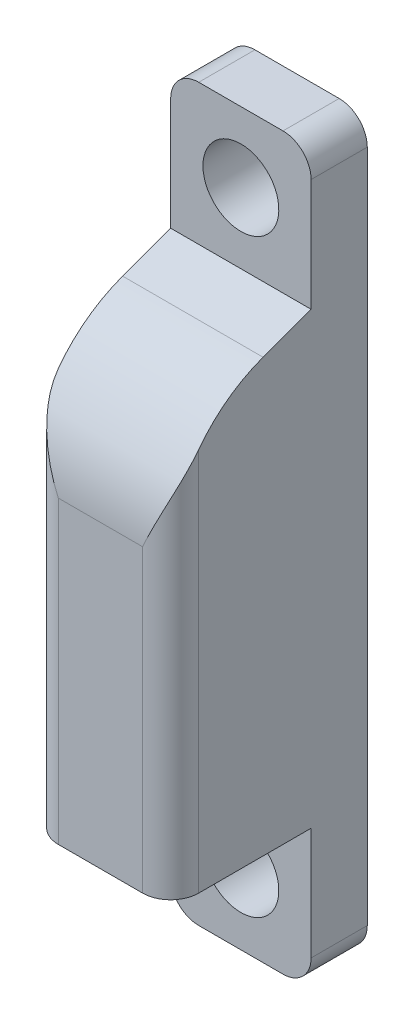
ISO-10303-21;
HEADER;
FILE_DESCRIPTION(('STEP AP214'),'2;1');
FILE_NAME('part.step','',(''),(''),'','','');
FILE_SCHEMA(('AUTOMOTIVE_DESIGN { 1 0 10303 214 1 1 1 1 }'));
ENDSEC;
DATA;
#1=APPLICATION_CONTEXT('core data for automotive mechanical design processes');
#2=APPLICATION_PROTOCOL_DEFINITION('international standard','automotive_design',2000,#1);
#3=PRODUCT_CONTEXT('',#1,'mechanical');
#4=PRODUCT('Part','Part','',(#3));
#5=PRODUCT_RELATED_PRODUCT_CATEGORY('part','',(#4));
#6=PRODUCT_DEFINITION_FORMATION('','',#4);
#7=PRODUCT_DEFINITION_CONTEXT('part definition',#1,'design');
#8=PRODUCT_DEFINITION('design','',#6,#7);
#9=PRODUCT_DEFINITION_SHAPE('','',#8);
#10=(LENGTH_UNIT() NAMED_UNIT(*) SI_UNIT(.MILLI.,.METRE.));
#11=(NAMED_UNIT(*) PLANE_ANGLE_UNIT() SI_UNIT($,.RADIAN.));
#12=(NAMED_UNIT(*) SI_UNIT($,.STERADIAN.) SOLID_ANGLE_UNIT());
#13=UNCERTAINTY_MEASURE_WITH_UNIT(LENGTH_MEASURE(1.E-05),#10,'distance_accuracy_value','');
#14=(GEOMETRIC_REPRESENTATION_CONTEXT(3) GLOBAL_UNCERTAINTY_ASSIGNED_CONTEXT((#13)) GLOBAL_UNIT_ASSIGNED_CONTEXT((#10,
#11,#12)) REPRESENTATION_CONTEXT('',''));
#15=CARTESIAN_POINT('',(0.,0.,0.));
#16=DIRECTION('',(0.,0.,1.));
#17=DIRECTION('',(1.,0.,0.));
#18=AXIS2_PLACEMENT_3D('',#15,#16,#17);
#19=CARTESIAN_POINT('',(2.5,13.0000000000001,6.99999999999996));
#20=DIRECTION('',(0.,0.,-1.));
#21=DIRECTION('',(-1.,0.,0.));
#22=AXIS2_PLACEMENT_3D('',#19,#20,#21);
#23=PLANE('',#22);
#24=DIRECTION('',(-1.,0.,0.));
#25=VECTOR('',#24,1.);
#26=CARTESIAN_POINT('',(9.80149698937106,2.67911113762051,7.));
#27=LINE('',#26,#25);
#28=CARTESIAN_POINT('',(1.5,2.67911113762052,7.));
#29=VERTEX_POINT('',#28);
#30=CARTESIAN_POINT('',(-1.5,2.67911113762052,7.));
#31=VERTEX_POINT('',#30);
#32=EDGE_CURVE('E52',#29,#31,#27,.T.);
#33=ORIENTED_EDGE('',*,*,#32,.T.);
#34=DIRECTION('',(0.,-1.,0.));
#35=VECTOR('',#34,1.);
#36=CARTESIAN_POINT('',(-1.5,13.,6.99999999999996));
#37=LINE('',#36,#35);
#38=CARTESIAN_POINT('',(-1.5,-7.99999999999999,7.));
#39=VERTEX_POINT('',#38);
#40=EDGE_CURVE('E232',#31,#39,#37,.T.);
#41=ORIENTED_EDGE('',*,*,#40,.T.);
#42=DIRECTION('',(1.,0.,0.));
#43=VECTOR('',#42,1.);
#44=CARTESIAN_POINT('',(-9.57106781186547,-7.99999999999992,7.));
#45=LINE('',#44,#43);
#46=CARTESIAN_POINT('',(1.49999999999999,-7.99999999999994,7.));
#47=VERTEX_POINT('',#46);
#48=EDGE_CURVE('E196',#39,#47,#45,.T.);
#49=ORIENTED_EDGE('',*,*,#48,.T.);
#50=DIRECTION('',(0.,1.,0.));
#51=VECTOR('',#50,1.);
#52=CARTESIAN_POINT('',(1.5,13.0000000000001,7.));
#53=LINE('',#52,#51);
#54=EDGE_CURVE('E227',#47,#29,#53,.T.);
#55=ORIENTED_EDGE('',*,*,#54,.T.);
#56=EDGE_LOOP('',(#33,#41,#49,#55));
#57=FACE_BOUND('',#56,.T.);
#58=ADVANCED_FACE('F32',(#57),#23,.F.);
#59=CARTESIAN_POINT('',(2.49999999999996,-13.,6.99999999999996));
#60=DIRECTION('',(-1.,0.,0.));
#61=DIRECTION('',(0.,0.,1.));
#62=AXIS2_PLACEMENT_3D('',#59,#60,#61);
#63=PLANE('',#62);
#64=DIRECTION('',(0.,0.342020143325663,-0.939692620785911));
#65=VECTOR('',#64,1.);
#66=CARTESIAN_POINT('',(2.49999999999996,8.00000000000006,1.99999999999999));
#67=LINE('',#66,#65);
#68=CARTESIAN_POINT('',(2.5,7.37757424155007,3.71010071662827));
#69=VERTEX_POINT('',#68);
#70=CARTESIAN_POINT('',(2.49999999999996,8.00000000000006,1.99999999999999));
#71=VERTEX_POINT('',#70);
#72=EDGE_CURVE('E153',#69,#71,#67,.T.);
#73=ORIENTED_EDGE('',*,*,#72,.F.);
#74=CARTESIAN_POINT('',(2.5,2.67911113762059,1.99999999999999));
#75=DIRECTION('',(-1.,0.,0.));
#76=DIRECTION('',(0.,0.,1.));
#77=AXIS2_PLACEMENT_3D('',#74,#75,#76);
#78=CIRCLE('',#77,5.);
#79=CARTESIAN_POINT('',(2.5,5.67911113762053,5.99999999999996));
#80=VERTEX_POINT('',#79);
#81=EDGE_CURVE('E307',#80,#69,#78,.T.);
#82=ORIENTED_EDGE('',*,*,#81,.F.);
#83=DIRECTION('',(0.,1.,0.));
#84=VECTOR('',#83,1.);
#85=CARTESIAN_POINT('',(2.5,-13.,6.));
#86=LINE('',#85,#84);
#87=CARTESIAN_POINT('',(2.5,-7.99999999999992,5.99999999999996));
#88=VERTEX_POINT('',#87);
#89=EDGE_CURVE('E240',#80,#88,#86,.F.);
#90=ORIENTED_EDGE('',*,*,#89,.T.);
#91=DIRECTION('',(0.,0.,1.));
#92=VECTOR('',#91,1.);
#93=CARTESIAN_POINT('',(2.5,-7.99999999999994,6.99999999999998));
#94=LINE('',#93,#92);
#95=CARTESIAN_POINT('',(2.5,-7.99999999999992,1.99999999999999));
#96=VERTEX_POINT('',#95);
#97=EDGE_CURVE('E200',#96,#88,#94,.T.);
#98=ORIENTED_EDGE('',*,*,#97,.F.);
#99=DIRECTION('',(0.,1.,0.));
#100=VECTOR('',#99,1.);
#101=CARTESIAN_POINT('',(2.49999999999996,-12.9999999999999,1.99999999999996));
#102=LINE('',#101,#100);
#103=CARTESIAN_POINT('',(2.5,-11.9999999999999,1.99999999999998));
#104=VERTEX_POINT('',#103);
#105=EDGE_CURVE('E178',#104,#96,#102,.T.);
#106=ORIENTED_EDGE('',*,*,#105,.F.);
#107=DIRECTION('',(0.,0.,-1.));
#108=VECTOR('',#107,1.);
#109=CARTESIAN_POINT('',(2.5,-12.,6.99999999999999));
#110=LINE('',#109,#108);
#111=CARTESIAN_POINT('',(2.5,-12.,0.));
#112=VERTEX_POINT('',#111);
#113=EDGE_CURVE('E255',#104,#112,#110,.T.);
#114=ORIENTED_EDGE('',*,*,#113,.T.);
#115=DIRECTION('',(0.,1.,0.));
#116=VECTOR('',#115,1.);
#117=CARTESIAN_POINT('',(2.5,-13.,0.));
#118=LINE('',#117,#116);
#119=CARTESIAN_POINT('',(2.5,12.0000000000001,0.));
#120=VERTEX_POINT('',#119);
#121=EDGE_CURVE('E216',#112,#120,#118,.T.);
#122=ORIENTED_EDGE('',*,*,#121,.T.);
#123=DIRECTION('',(0.,0.,-1.));
#124=VECTOR('',#123,1.);
#125=CARTESIAN_POINT('',(2.5,12.0000000000001,6.99999999999996));
#126=LINE('',#125,#124);
#127=CARTESIAN_POINT('',(2.5,12.0000000000001,1.99999999999995));
#128=VERTEX_POINT('',#127);
#129=EDGE_CURVE('E258',#120,#128,#126,.F.);
#130=ORIENTED_EDGE('',*,*,#129,.T.);
#131=DIRECTION('',(0.,1.,0.));
#132=VECTOR('',#131,1.);
#133=CARTESIAN_POINT('',(2.5,13.0000000000001,1.99999999999997));
#134=LINE('',#133,#132);
#135=EDGE_CURVE('E159',#71,#128,#134,.T.);
#136=ORIENTED_EDGE('',*,*,#135,.F.);
#137=EDGE_LOOP('',(#73,#82,#90,#98,#106,#114,#122,#130,#136));
#138=FACE_BOUND('',#137,.T.);
#139=ADVANCED_FACE('F282',(#138),#63,.F.);
#140=CARTESIAN_POINT('',(-2.5,13.,6.99999999999996));
#141=DIRECTION('',(0.,-1.,0.));
#142=DIRECTION('',(0.,0.,-1.));
#143=AXIS2_PLACEMENT_3D('',#140,#141,#142);
#144=PLANE('',#143);
#145=DIRECTION('',(1.,0.,0.));
#146=VECTOR('',#145,1.);
#147=CARTESIAN_POINT('',(-9.57106781186547,13.0000000000002,1.99999999999999));
#148=LINE('',#147,#146);
#149=CARTESIAN_POINT('',(-1.5,13.0000000000001,1.99999999999999));
#150=VERTEX_POINT('',#149);
#151=CARTESIAN_POINT('',(1.49999999999999,13.0000000000001,2.00000000000001));
#152=VERTEX_POINT('',#151);
#153=EDGE_CURVE('E158',#150,#152,#148,.T.);
#154=ORIENTED_EDGE('',*,*,#153,.T.);
#155=DIRECTION('',(0.,0.,-1.));
#156=VECTOR('',#155,1.);
#157=CARTESIAN_POINT('',(1.5,13.0000000000001,7.));
#158=LINE('',#157,#156);
#159=CARTESIAN_POINT('',(1.5,13.,0.));
#160=VERTEX_POINT('',#159);
#161=EDGE_CURVE('E244',#152,#160,#158,.T.);
#162=ORIENTED_EDGE('',*,*,#161,.T.);
#163=DIRECTION('',(-1.,0.,0.));
#164=VECTOR('',#163,1.);
#165=CARTESIAN_POINT('',(-2.5,13.,0.));
#166=LINE('',#165,#164);
#167=CARTESIAN_POINT('',(-1.5,13.,0.));
#168=VERTEX_POINT('',#167);
#169=EDGE_CURVE('E219',#160,#168,#166,.T.);
#170=ORIENTED_EDGE('',*,*,#169,.T.);
#171=DIRECTION('',(0.,0.,-1.));
#172=VECTOR('',#171,1.);
#173=CARTESIAN_POINT('',(-1.5,13.,6.99999999999996));
#174=LINE('',#173,#172);
#175=EDGE_CURVE('E242',#168,#150,#174,.F.);
#176=ORIENTED_EDGE('',*,*,#175,.T.);
#177=EDGE_LOOP('',(#154,#162,#170,#176));
#178=FACE_BOUND('',#177,.T.);
#179=ADVANCED_FACE('F300',(#178),#144,.F.);
#180=CARTESIAN_POINT('',(-2.50000000000004,-13.,6.99999999999996));
#181=DIRECTION('',(1.,0.,0.));
#182=DIRECTION('',(0.,0.,-1.));
#183=AXIS2_PLACEMENT_3D('',#180,#181,#182);
#184=PLANE('',#183);
#185=DIRECTION('',(0.,-1.,0.));
#186=VECTOR('',#185,1.);
#187=CARTESIAN_POINT('',(-2.5,-13.,6.));
#188=LINE('',#187,#186);
#189=CARTESIAN_POINT('',(-2.5,-7.99999999999994,5.99999999999996));
#190=VERTEX_POINT('',#189);
#191=CARTESIAN_POINT('',(-2.5,5.67911113762051,5.99999999999996));
#192=VERTEX_POINT('',#191);
#193=EDGE_CURVE('E238',#190,#192,#188,.F.);
#194=ORIENTED_EDGE('',*,*,#193,.T.);
#195=CARTESIAN_POINT('',(-2.5,2.67911113762052,1.99999999999999));
#196=DIRECTION('',(1.,0.,0.));
#197=DIRECTION('',(0.,0.,1.));
#198=AXIS2_PLACEMENT_3D('',#195,#196,#197);
#199=CIRCLE('',#198,5.);
#200=CARTESIAN_POINT('',(-2.5,7.37757424155007,3.71010071662827));
#201=VERTEX_POINT('',#200);
#202=EDGE_CURVE('E168',#201,#192,#199,.T.);
#203=ORIENTED_EDGE('',*,*,#202,.F.);
#204=DIRECTION('',(0.,-0.342020143325663,0.939692620785911));
#205=VECTOR('',#204,1.);
#206=CARTESIAN_POINT('',(-2.50000000000004,7.99999999999999,2.));
#207=LINE('',#206,#205);
#208=CARTESIAN_POINT('',(-2.50000000000004,7.99999999999999,2.));
#209=VERTEX_POINT('',#208);
#210=EDGE_CURVE('E150',#209,#201,#207,.T.);
#211=ORIENTED_EDGE('',*,*,#210,.F.);
#212=DIRECTION('',(0.,-1.,0.));
#213=VECTOR('',#212,1.);
#214=CARTESIAN_POINT('',(-2.5,13.0000000000001,1.99999999999998));
#215=LINE('',#214,#213);
#216=CARTESIAN_POINT('',(-2.5,12.0000000000001,1.99999999999996));
#217=VERTEX_POINT('',#216);
#218=EDGE_CURVE('E166',#217,#209,#215,.T.);
#219=ORIENTED_EDGE('',*,*,#218,.F.);
#220=DIRECTION('',(0.,0.,-1.));
#221=VECTOR('',#220,1.);
#222=CARTESIAN_POINT('',(-2.5,12.,6.99999999999996));
#223=LINE('',#222,#221);
#224=CARTESIAN_POINT('',(-2.5,12.0000000000001,0.));
#225=VERTEX_POINT('',#224);
#226=EDGE_CURVE('E265',#217,#225,#223,.T.);
#227=ORIENTED_EDGE('',*,*,#226,.T.);
#228=DIRECTION('',(0.,-1.,0.));
#229=VECTOR('',#228,1.);
#230=CARTESIAN_POINT('',(-2.5,-13.,0.));
#231=LINE('',#230,#229);
#232=CARTESIAN_POINT('',(-2.5,-12.,0.));
#233=VERTEX_POINT('',#232);
#234=EDGE_CURVE('E222',#225,#233,#231,.T.);
#235=ORIENTED_EDGE('',*,*,#234,.T.);
#236=DIRECTION('',(0.,0.,-1.));
#237=VECTOR('',#236,1.);
#238=CARTESIAN_POINT('',(-2.5,-12.,6.99999999999999));
#239=LINE('',#238,#237);
#240=CARTESIAN_POINT('',(-2.5,-12.,1.99999999999996));
#241=VERTEX_POINT('',#240);
#242=EDGE_CURVE('E263',#233,#241,#239,.F.);
#243=ORIENTED_EDGE('',*,*,#242,.T.);
#244=DIRECTION('',(0.,-1.,0.));
#245=VECTOR('',#244,1.);
#246=CARTESIAN_POINT('',(-2.50000000000004,-13.,1.99999999999999));
#247=LINE('',#246,#245);
#248=CARTESIAN_POINT('',(-2.5,-7.99999999999992,1.99999999999998));
#249=VERTEX_POINT('',#248);
#250=EDGE_CURVE('E192',#249,#241,#247,.T.);
#251=ORIENTED_EDGE('',*,*,#250,.F.);
#252=DIRECTION('',(0.,0.,-1.));
#253=VECTOR('',#252,1.);
#254=CARTESIAN_POINT('',(-2.5,-7.99999999999997,6.99999999999997));
#255=LINE('',#254,#253);
#256=EDGE_CURVE('E195',#190,#249,#255,.T.);
#257=ORIENTED_EDGE('',*,*,#256,.F.);
#258=EDGE_LOOP('',(#194,#203,#211,#219,#227,#235,#243,#251,#257));
#259=FACE_BOUND('',#258,.T.);
#260=ADVANCED_FACE('F164',(#259),#184,.F.);
#261=CARTESIAN_POINT('',(-2.50000000000004,-13.,6.99999999999996));
#262=DIRECTION('',(0.,1.,0.));
#263=DIRECTION('',(0.,0.,1.));
#264=AXIS2_PLACEMENT_3D('',#261,#262,#263);
#265=PLANE('',#264);
#266=DIRECTION('',(1.,0.,0.));
#267=VECTOR('',#266,1.);
#268=CARTESIAN_POINT('',(-2.5,-13.,0.));
#269=LINE('',#268,#267);
#270=CARTESIAN_POINT('',(-1.5,-13.,0.));
#271=VERTEX_POINT('',#270);
#272=CARTESIAN_POINT('',(1.5,-13.,0.));
#273=VERTEX_POINT('',#272);
#274=EDGE_CURVE('E225',#271,#273,#269,.T.);
#275=ORIENTED_EDGE('',*,*,#274,.T.);
#276=DIRECTION('',(0.,0.,-1.));
#277=VECTOR('',#276,1.);
#278=CARTESIAN_POINT('',(1.49999999999996,-13.,7.));
#279=LINE('',#278,#277);
#280=CARTESIAN_POINT('',(1.49999999999996,-12.9999999999999,1.99999999999999));
#281=VERTEX_POINT('',#280);
#282=EDGE_CURVE('E60',#273,#281,#279,.F.);
#283=ORIENTED_EDGE('',*,*,#282,.T.);
#284=DIRECTION('',(1.,0.,0.));
#285=VECTOR('',#284,1.);
#286=CARTESIAN_POINT('',(-9.57106781186547,-12.9999999999999,1.99999999999997));
#287=LINE('',#286,#285);
#288=CARTESIAN_POINT('',(-1.50000000000004,-13.,1.99999999999999));
#289=VERTEX_POINT('',#288);
#290=EDGE_CURVE('E203',#289,#281,#287,.T.);
#291=ORIENTED_EDGE('',*,*,#290,.F.);
#292=DIRECTION('',(0.,0.,-1.));
#293=VECTOR('',#292,1.);
#294=CARTESIAN_POINT('',(-1.50000000000004,-13.,6.99999999999996));
#295=LINE('',#294,#293);
#296=EDGE_CURVE('E267',#289,#271,#295,.T.);
#297=ORIENTED_EDGE('',*,*,#296,.T.);
#298=EDGE_LOOP('',(#275,#283,#291,#297));
#299=FACE_BOUND('',#298,.T.);
#300=ADVANCED_FACE('F289',(#299),#265,.F.);
#301=CARTESIAN_POINT('',(2.5,13.,0.));
#302=DIRECTION('',(0.,0.,-1.));
#303=DIRECTION('',(-1.,0.,0.));
#304=AXIS2_PLACEMENT_3D('',#301,#302,#303);
#305=PLANE('',#304);
#306=CARTESIAN_POINT('',(0.,10.5000000000001,0.));
#307=DIRECTION('',(0.,0.,-1.));
#308=DIRECTION('',(-1.,0.,0.));
#309=AXIS2_PLACEMENT_3D('',#306,#307,#308);
#310=CIRCLE('',#309,1.34999999999999);
#311=CARTESIAN_POINT('',(-1.35000000000001,10.5000000000001,0.));
#312=VERTEX_POINT('',#311);
#313=EDGE_CURVE('E210',#312,#312,#310,.T.);
#314=ORIENTED_EDGE('',*,*,#313,.F.);
#315=EDGE_LOOP('',(#314));
#316=FACE_BOUND('',#315,.T.);
#317=CARTESIAN_POINT('',(0.,-10.5,0.));
#318=DIRECTION('',(0.,0.,-1.));
#319=DIRECTION('',(-1.,0.,0.));
#320=AXIS2_PLACEMENT_3D('',#317,#318,#319);
#321=CIRCLE('',#320,1.34999999999999);
#322=CARTESIAN_POINT('',(-1.35000000000003,-10.5,0.));
#323=VERTEX_POINT('',#322);
#324=EDGE_CURVE('E213',#323,#323,#321,.T.);
#325=ORIENTED_EDGE('',*,*,#324,.F.);
#326=EDGE_LOOP('',(#325));
#327=FACE_BOUND('',#326,.T.);
#328=ORIENTED_EDGE('',*,*,#169,.F.);
#329=CARTESIAN_POINT('',(1.5,12.0000000000001,0.));
#330=DIRECTION('',(0.,0.,-1.));
#331=DIRECTION('',(-1.,0.,0.));
#332=AXIS2_PLACEMENT_3D('',#329,#330,#331);
#333=CIRCLE('',#332,1.);
#334=EDGE_CURVE('E253',#160,#120,#333,.T.);
#335=ORIENTED_EDGE('',*,*,#334,.T.);
#336=ORIENTED_EDGE('',*,*,#121,.F.);
#337=CARTESIAN_POINT('',(1.49999999999999,-12.,0.));
#338=DIRECTION('',(0.,0.,-1.));
#339=DIRECTION('',(-1.,0.,0.));
#340=AXIS2_PLACEMENT_3D('',#337,#338,#339);
#341=CIRCLE('',#340,1.);
#342=EDGE_CURVE('E249',#112,#273,#341,.T.);
#343=ORIENTED_EDGE('',*,*,#342,.T.);
#344=ORIENTED_EDGE('',*,*,#274,.F.);
#345=CARTESIAN_POINT('',(-1.5,-12.,0.));
#346=DIRECTION('',(0.,0.,-1.));
#347=DIRECTION('',(-1.,0.,0.));
#348=AXIS2_PLACEMENT_3D('',#345,#346,#347);
#349=CIRCLE('',#348,1.);
#350=EDGE_CURVE('E247',#271,#233,#349,.T.);
#351=ORIENTED_EDGE('',*,*,#350,.T.);
#352=ORIENTED_EDGE('',*,*,#234,.F.);
#353=CARTESIAN_POINT('',(-1.5,12.0000000000001,0.));
#354=DIRECTION('',(0.,0.,-1.));
#355=DIRECTION('',(-1.,0.,0.));
#356=AXIS2_PLACEMENT_3D('',#353,#354,#355);
#357=CIRCLE('',#356,1.);
#358=EDGE_CURVE('E251',#225,#168,#357,.T.);
#359=ORIENTED_EDGE('',*,*,#358,.T.);
#360=EDGE_LOOP('',(#328,#335,#336,#343,#344,#351,#352,#359));
#361=FACE_BOUND('',#360,.T.);
#362=ADVANCED_FACE('F288',(#316,#327,#361),#305,.T.);
#363=CARTESIAN_POINT('',(0.,-10.5,0.));
#364=DIRECTION('',(0.,0.,-1.));
#365=DIRECTION('',(-1.,0.,0.));
#366=AXIS2_PLACEMENT_3D('',#363,#364,#365);
#367=CYLINDRICAL_SURFACE('',#366,1.34999999999999);
#368=CARTESIAN_POINT('',(0.,-10.4999999999999,2.));
#369=DIRECTION('',(0.,0.,-1.));
#370=DIRECTION('',(-1.,0.,0.));
#371=AXIS2_PLACEMENT_3D('',#368,#369,#370);
#372=CIRCLE('',#371,1.34999999999999);
#373=CARTESIAN_POINT('',(-1.34999999999999,-10.4999999999999,2.));
#374=VERTEX_POINT('',#373);
#375=EDGE_CURVE('E198',#374,#374,#372,.F.);
#376=ORIENTED_EDGE('',*,*,#375,.T.);
#377=EDGE_LOOP('',(#376));
#378=FACE_BOUND('',#377,.T.);
#379=ORIENTED_EDGE('',*,*,#324,.T.);
#380=EDGE_LOOP('',(#379));
#381=FACE_BOUND('',#380,.T.);
#382=ADVANCED_FACE('F345',(#378,#381),#367,.F.);
#383=CARTESIAN_POINT('',(0.,10.5000000000001,0.));
#384=DIRECTION('',(0.,0.,-1.));
#385=DIRECTION('',(-1.,0.,0.));
#386=AXIS2_PLACEMENT_3D('',#383,#384,#385);
#387=CYLINDRICAL_SURFACE('',#386,1.34999999999999);
#388=CARTESIAN_POINT('',(0.,10.5,1.99999999999996));
#389=DIRECTION('',(0.,0.,-1.));
#390=DIRECTION('',(0.,1.,0.));
#391=AXIS2_PLACEMENT_3D('',#388,#389,#390);
#392=CIRCLE('',#391,1.34999999999999);
#393=CARTESIAN_POINT('',(0.,11.85,1.99999999999996));
#394=VERTEX_POINT('',#393);
#395=EDGE_CURVE('E175',#394,#394,#392,.F.);
#396=ORIENTED_EDGE('',*,*,#395,.T.);
#397=EDGE_LOOP('',(#396));
#398=FACE_BOUND('',#397,.T.);
#399=ORIENTED_EDGE('',*,*,#313,.T.);
#400=EDGE_LOOP('',(#399));
#401=FACE_BOUND('',#400,.T.);
#402=ADVANCED_FACE('F378',(#398,#401),#387,.F.);
#403=CARTESIAN_POINT('',(-9.57106781186547,-12.9999999999999,1.99999999999997));
#404=DIRECTION('',(0.,0.,-1.));
#405=DIRECTION('',(-1.,0.,0.));
#406=AXIS2_PLACEMENT_3D('',#403,#404,#405);
#407=PLANE('',#406);
#408=ORIENTED_EDGE('',*,*,#290,.T.);
#409=CARTESIAN_POINT('',(1.5,-11.9999999999999,2.));
#410=DIRECTION('',(0.,0.,-1.));
#411=DIRECTION('',(-1.,0.,0.));
#412=AXIS2_PLACEMENT_3D('',#409,#410,#411);
#413=CIRCLE('',#412,1.);
#414=EDGE_CURVE('E46',#281,#104,#413,.F.);
#415=ORIENTED_EDGE('',*,*,#414,.T.);
#416=ORIENTED_EDGE('',*,*,#105,.T.);
#417=DIRECTION('',(1.,0.,0.));
#418=VECTOR('',#417,1.);
#419=CARTESIAN_POINT('',(-9.57106781186548,-7.99999999999985,2.00000000000001));
#420=LINE('',#419,#418);
#421=EDGE_CURVE('E206',#249,#96,#420,.T.);
#422=ORIENTED_EDGE('',*,*,#421,.F.);
#423=ORIENTED_EDGE('',*,*,#250,.T.);
#424=CARTESIAN_POINT('',(-1.5,-12.,1.99999999999999));
#425=DIRECTION('',(0.,0.,-1.));
#426=DIRECTION('',(-1.,0.,0.));
#427=AXIS2_PLACEMENT_3D('',#424,#425,#426);
#428=CIRCLE('',#427,1.);
#429=EDGE_CURVE('E271',#241,#289,#428,.F.);
#430=ORIENTED_EDGE('',*,*,#429,.T.);
#431=EDGE_LOOP('',(#408,#415,#416,#422,#423,#430));
#432=FACE_BOUND('',#431,.T.);
#433=ORIENTED_EDGE('',*,*,#375,.F.);
#434=EDGE_LOOP('',(#433));
#435=FACE_BOUND('',#434,.T.);
#436=ADVANCED_FACE('F275',(#432,#435),#407,.F.);
#437=CARTESIAN_POINT('',(-9.57106781186547,-7.99999999999992,7.));
#438=DIRECTION('',(0.,1.,0.));
#439=DIRECTION('',(0.,0.,1.));
#440=AXIS2_PLACEMENT_3D('',#437,#438,#439);
#441=PLANE('',#440);
#442=ORIENTED_EDGE('',*,*,#48,.F.);
#443=CARTESIAN_POINT('',(-1.5,-7.99999999999994,5.99999999999998));
#444=DIRECTION('',(0.,1.,0.));
#445=DIRECTION('',(0.,0.,1.));
#446=AXIS2_PLACEMENT_3D('',#443,#444,#445);
#447=CIRCLE('',#446,1.);
#448=EDGE_CURVE('E236',#39,#190,#447,.F.);
#449=ORIENTED_EDGE('',*,*,#448,.T.);
#450=ORIENTED_EDGE('',*,*,#256,.T.);
#451=ORIENTED_EDGE('',*,*,#421,.T.);
#452=ORIENTED_EDGE('',*,*,#97,.T.);
#453=CARTESIAN_POINT('',(1.5,-7.99999999999992,6.));
#454=DIRECTION('',(0.,1.,0.));
#455=DIRECTION('',(0.,0.,1.));
#456=AXIS2_PLACEMENT_3D('',#453,#454,#455);
#457=CIRCLE('',#456,1.);
#458=EDGE_CURVE('E234',#88,#47,#457,.F.);
#459=ORIENTED_EDGE('',*,*,#458,.T.);
#460=EDGE_LOOP('',(#442,#449,#450,#451,#452,#459));
#461=FACE_BOUND('',#460,.T.);
#462=ADVANCED_FACE('F324',(#461),#441,.F.);
#463=CARTESIAN_POINT('',(-9.57106781186547,13.0000000000002,1.99999999999999));
#464=DIRECTION('',(0.,0.,-1.));
#465=DIRECTION('',(0.,1.,0.));
#466=AXIS2_PLACEMENT_3D('',#463,#464,#465);
#467=PLANE('',#466);
#468=ORIENTED_EDGE('',*,*,#135,.T.);
#469=CARTESIAN_POINT('',(1.5,12.0000000000001,1.99999999999999));
#470=DIRECTION('',(0.,0.,-1.));
#471=DIRECTION('',(0.,1.,0.));
#472=AXIS2_PLACEMENT_3D('',#469,#470,#471);
#473=CIRCLE('',#472,1.);
#474=EDGE_CURVE('E261',#128,#152,#473,.F.);
#475=ORIENTED_EDGE('',*,*,#474,.T.);
#476=ORIENTED_EDGE('',*,*,#153,.F.);
#477=CARTESIAN_POINT('',(-1.5,12.0000000000001,1.99999999999996));
#478=DIRECTION('',(0.,0.,-1.));
#479=DIRECTION('',(0.,1.,0.));
#480=AXIS2_PLACEMENT_3D('',#477,#478,#479);
#481=CIRCLE('',#480,1.);
#482=EDGE_CURVE('E174',#150,#217,#481,.F.);
#483=ORIENTED_EDGE('',*,*,#482,.T.);
#484=ORIENTED_EDGE('',*,*,#218,.T.);
#485=DIRECTION('',(1.,0.,0.));
#486=VECTOR('',#485,1.);
#487=CARTESIAN_POINT('',(-9.57106781186548,8.00000000000006,2.00000000000002));
#488=LINE('',#487,#486);
#489=EDGE_CURVE('E146',#209,#71,#488,.T.);
#490=ORIENTED_EDGE('',*,*,#489,.T.);
#491=EDGE_LOOP('',(#468,#475,#476,#483,#484,#490));
#492=FACE_BOUND('',#491,.T.);
#493=ORIENTED_EDGE('',*,*,#395,.F.);
#494=EDGE_LOOP('',(#493));
#495=FACE_BOUND('',#494,.T.);
#496=ADVANCED_FACE('F170',(#492,#495),#467,.F.);
#497=CARTESIAN_POINT('',(-1.5,13.0000000000001,6.));
#498=DIRECTION('',(0.,-1.,0.));
#499=DIRECTION('',(0.,0.,-1.));
#500=AXIS2_PLACEMENT_3D('',#497,#498,#499);
#501=CYLINDRICAL_SURFACE('',#500,1.);
#502=CARTESIAN_POINT('',(-2.5,5.67911113762051,5.99999999999996));
#503=CARTESIAN_POINT('',(-2.49996283766288,5.61605583292701,6.04730456090694));
#504=CARTESIAN_POINT('',(-2.49664751888849,5.55193642082809,6.0930515988322));
#505=CARTESIAN_POINT('',(-2.48446421596849,5.4220934133321,6.18116773558685));
#506=CARTESIAN_POINT('',(-2.47560680021901,5.35637309946738,6.2235430910174));
#507=CARTESIAN_POINT('',(-2.45341063181507,5.22405884302658,6.30455906147391));
#508=CARTESIAN_POINT('',(-2.44010261823863,5.15747382494862,6.34322301470524));
#509=CARTESIAN_POINT('',(-2.40972691765817,5.02322544464247,6.41712604462193));
#510=CARTESIAN_POINT('',(-2.39265676004379,4.95556140102902,6.45236284866976));
#511=CARTESIAN_POINT('',(-2.34353105342675,4.77604106048579,6.54073885270199));
#512=CARTESIAN_POINT('',(-2.3088536971532,4.66347377608253,6.5909944731759));
#513=CARTESIAN_POINT('',(-2.23330930529318,4.43676667549628,6.68247844584447));
#514=CARTESIAN_POINT('',(-2.19243965071078,4.32262621260343,6.72370296025586));
#515=CARTESIAN_POINT('',(-2.10598853859227,4.09280601775805,6.79750849080414));
#516=CARTESIAN_POINT('',(-2.0603893855201,3.97712202744852,6.83005529038535));
#517=CARTESIAN_POINT('',(-1.96595203824319,3.7450390725777,6.88651783154782));
#518=CARTESIAN_POINT('',(-1.91711489227281,3.62864035036199,6.91043635036511));
#519=CARTESIAN_POINT('',(-1.8088464332045,3.37563494334859,6.95317913466609));
#520=CARTESIAN_POINT('',(-1.74901944257455,3.23893724987035,6.97045955968915));
#521=CARTESIAN_POINT('',(-1.62805007886773,2.96548409633984,6.99367348018759));
#522=CARTESIAN_POINT('',(-1.56691069313369,2.8287293448548,6.99963044853022));
#523=CARTESIAN_POINT('',(-1.50384898146051,2.68771772373473,6.99999444155622));
#524=CARTESIAN_POINT('',(-1.50192447842606,2.68341440426196,6.99999999677524));
#525=CARTESIAN_POINT('',(-1.5,2.67911113762052,7.));
#526=B_SPLINE_CURVE_WITH_KNOTS('',3,(#502,#503,#504,#505,#506,#507,#508,#509,#510,#511,#512,
#513,#514,#515,#516,#517,#518,#519,#520,#521,#522,#523,#524,#525),.UNSPECIFIED.,.F.,.F.,(4,2,2,
2,2,2,2,2,2,2,2,4),(0.,0.236272200851084,0.472095214354607,0.706321989678227,0.940703043144827,
1.32429275355726,1.70804515619833,2.09328905143222,2.47840883504635,2.92860728181183,
3.37787147131314,3.39201361675779),.UNSPECIFIED.);
#527=EDGE_CURVE('E184',#192,#31,#526,.T.);
#528=ORIENTED_EDGE('',*,*,#527,.F.);
#529=ORIENTED_EDGE('',*,*,#193,.F.);
#530=ORIENTED_EDGE('',*,*,#448,.F.);
#531=ORIENTED_EDGE('',*,*,#40,.F.);
#532=EDGE_LOOP('',(#528,#529,#530,#531));
#533=FACE_BOUND('',#532,.T.);
#534=ADVANCED_FACE('F319',(#533),#501,.T.);
#535=CARTESIAN_POINT('',(1.5,13.0000000000001,6.00000000000001));
#536=DIRECTION('',(0.,1.,0.));
#537=DIRECTION('',(0.,0.,1.));
#538=AXIS2_PLACEMENT_3D('',#535,#536,#537);
#539=CYLINDRICAL_SURFACE('',#538,1.);
#540=CARTESIAN_POINT('',(2.5,5.67911113762053,5.99999999999996));
#541=CARTESIAN_POINT('',(2.49996283766288,5.61605583292702,6.04730456090694));
#542=CARTESIAN_POINT('',(2.49664751888849,5.55193642082809,6.0930515988322));
#543=CARTESIAN_POINT('',(2.4844642159685,5.42209341333209,6.18116773558685));
#544=CARTESIAN_POINT('',(2.47560680021901,5.35637309946737,6.22354309101741));
#545=CARTESIAN_POINT('',(2.45341063181507,5.22405884302656,6.30455906147391));
#546=CARTESIAN_POINT('',(2.44010261823863,5.1574738249486,6.34322301470524));
#547=CARTESIAN_POINT('',(2.40972691765817,5.02322544464247,6.41712604462195));
#548=CARTESIAN_POINT('',(2.39265676004379,4.95556140102903,6.4523628486698));
#549=CARTESIAN_POINT('',(2.34353105342675,4.77604106048581,6.54073885270204));
#550=CARTESIAN_POINT('',(2.30885369715321,4.66347377608254,6.59099447317591));
#551=CARTESIAN_POINT('',(2.2333093052932,4.43676667549628,6.68247844584445));
#552=CARTESIAN_POINT('',(2.1924396507108,4.32262621260343,6.72370296025586));
#553=CARTESIAN_POINT('',(2.10598853859229,4.09280601775806,6.79750849080414));
#554=CARTESIAN_POINT('',(2.06038938552013,3.97712202744852,6.83005529038535));
#555=CARTESIAN_POINT('',(1.96595203824321,3.7450390725777,6.88651783154782));
#556=CARTESIAN_POINT('',(1.91711489227281,3.62864035036199,6.91043635036512));
#557=CARTESIAN_POINT('',(1.80884643320451,3.37563494334859,6.95317913466609));
#558=CARTESIAN_POINT('',(1.7490194425746,3.23893724987033,6.97045955968913));
#559=CARTESIAN_POINT('',(1.62805007886781,2.9654840963398,6.99367348018761));
#560=CARTESIAN_POINT('',(1.56691069313376,2.82872934485477,6.9996304485303));
#561=CARTESIAN_POINT('',(1.50384898146052,2.68771772373473,6.99999444155623));
#562=CARTESIAN_POINT('',(1.50192447842607,2.68341440426196,6.99999999677524));
#563=CARTESIAN_POINT('',(1.5,2.67911113762052,7.));
#564=B_SPLINE_CURVE_WITH_KNOTS('',3,(#540,#541,#542,#543,#544,#545,#546,#547,#548,#549,#550,
#551,#552,#553,#554,#555,#556,#557,#558,#559,#560,#561,#562,#563),.UNSPECIFIED.,.F.,.F.,(4,2,2,
2,2,2,2,2,2,2,2,4),(0.,0.236272200851093,0.472095214354629,0.706321989678246,0.940703043144842,
1.32429275355726,1.70804515619833,2.09328905143223,2.47840883504637,2.92860728181185,
3.37787147131316,3.39201361675781),.UNSPECIFIED.);
#565=EDGE_CURVE('E11',#29,#80,#564,.F.);
#566=ORIENTED_EDGE('',*,*,#565,.F.);
#567=ORIENTED_EDGE('',*,*,#54,.F.);
#568=ORIENTED_EDGE('',*,*,#458,.F.);
#569=ORIENTED_EDGE('',*,*,#89,.F.);
#570=EDGE_LOOP('',(#566,#567,#568,#569));
#571=FACE_BOUND('',#570,.T.);
#572=ADVANCED_FACE('F329',(#571),#539,.T.);
#573=CARTESIAN_POINT('',(1.5,12.0000000000001,7.));
#574=DIRECTION('',(0.,0.,-1.));
#575=DIRECTION('',(-1.,0.,0.));
#576=AXIS2_PLACEMENT_3D('',#573,#574,#575);
#577=CYLINDRICAL_SURFACE('',#576,1.);
#578=ORIENTED_EDGE('',*,*,#474,.F.);
#579=ORIENTED_EDGE('',*,*,#129,.F.);
#580=ORIENTED_EDGE('',*,*,#334,.F.);
#581=ORIENTED_EDGE('',*,*,#161,.F.);
#582=EDGE_LOOP('',(#578,#579,#580,#581));
#583=FACE_BOUND('',#582,.T.);
#584=ADVANCED_FACE('F304',(#583),#577,.T.);
#585=CARTESIAN_POINT('',(-1.5,12.,6.99999999999996));
#586=DIRECTION('',(0.,0.,-1.));
#587=DIRECTION('',(-1.,0.,0.));
#588=AXIS2_PLACEMENT_3D('',#585,#586,#587);
#589=CYLINDRICAL_SURFACE('',#588,1.);
#590=ORIENTED_EDGE('',*,*,#482,.F.);
#591=ORIENTED_EDGE('',*,*,#175,.F.);
#592=ORIENTED_EDGE('',*,*,#358,.F.);
#593=ORIENTED_EDGE('',*,*,#226,.F.);
#594=EDGE_LOOP('',(#590,#591,#592,#593));
#595=FACE_BOUND('',#594,.T.);
#596=ADVANCED_FACE('F297',(#595),#589,.T.);
#597=CARTESIAN_POINT('',(1.5,-12.,7.00000000000001));
#598=DIRECTION('',(0.,0.,-1.));
#599=DIRECTION('',(-1.,0.,0.));
#600=AXIS2_PLACEMENT_3D('',#597,#598,#599);
#601=CYLINDRICAL_SURFACE('',#600,1.);
#602=ORIENTED_EDGE('',*,*,#414,.F.);
#603=ORIENTED_EDGE('',*,*,#282,.F.);
#604=ORIENTED_EDGE('',*,*,#342,.F.);
#605=ORIENTED_EDGE('',*,*,#113,.F.);
#606=EDGE_LOOP('',(#602,#603,#604,#605));
#607=FACE_BOUND('',#606,.T.);
#608=ADVANCED_FACE('F284',(#607),#601,.T.);
#609=CARTESIAN_POINT('',(-1.5,-12.,6.99999999999999));
#610=DIRECTION('',(0.,0.,-1.));
#611=DIRECTION('',(-1.,0.,0.));
#612=AXIS2_PLACEMENT_3D('',#609,#610,#611);
#613=CYLINDRICAL_SURFACE('',#612,1.);
#614=ORIENTED_EDGE('',*,*,#429,.F.);
#615=ORIENTED_EDGE('',*,*,#242,.F.);
#616=ORIENTED_EDGE('',*,*,#350,.F.);
#617=ORIENTED_EDGE('',*,*,#296,.F.);
#618=EDGE_LOOP('',(#614,#615,#616,#617));
#619=FACE_BOUND('',#618,.T.);
#620=ADVANCED_FACE('F34',(#619),#613,.T.);
#621=CARTESIAN_POINT('',(9.80149698937106,2.67911113762052,2.00000000000002));
#622=DIRECTION('',(-1.,0.,0.));
#623=DIRECTION('',(0.,0.,1.));
#624=AXIS2_PLACEMENT_3D('',#621,#622,#623);
#625=CYLINDRICAL_SURFACE('',#624,5.);
#626=ORIENTED_EDGE('',*,*,#527,.T.);
#627=ORIENTED_EDGE('',*,*,#32,.F.);
#628=ORIENTED_EDGE('',*,*,#565,.T.);
#629=ORIENTED_EDGE('',*,*,#81,.T.);
#630=DIRECTION('',(-1.,0.,0.));
#631=VECTOR('',#630,1.);
#632=CARTESIAN_POINT('',(9.80149698937106,7.37757424155,3.71010071662831));
#633=LINE('',#632,#631);
#634=EDGE_CURVE('E311',#69,#201,#633,.T.);
#635=ORIENTED_EDGE('',*,*,#634,.T.);
#636=ORIENTED_EDGE('',*,*,#202,.T.);
#637=EDGE_LOOP('',(#626,#627,#628,#629,#635,#636));
#638=FACE_BOUND('',#637,.T.);
#639=ADVANCED_FACE('F315',(#638),#625,.T.);
#640=CARTESIAN_POINT('',(9.80149698937106,7.99999999999999,2.00000000000004));
#641=DIRECTION('',(0.,-0.939692620785911,-0.342020143325663));
#642=DIRECTION('',(0.,0.342020143325663,-0.939692620785911));
#643=AXIS2_PLACEMENT_3D('',#640,#641,#642);
#644=PLANE('',#643);
#645=ORIENTED_EDGE('',*,*,#72,.T.);
#646=ORIENTED_EDGE('',*,*,#489,.F.);
#647=ORIENTED_EDGE('',*,*,#210,.T.);
#648=ORIENTED_EDGE('',*,*,#634,.F.);
#649=EDGE_LOOP('',(#645,#646,#647,#648));
#650=FACE_BOUND('',#649,.T.);
#651=ADVANCED_FACE('F148',(#650),#644,.F.);
#652=CLOSED_SHELL('',(#58,#139,#179,#260,#300,#362,#382,#402,#436,#462,#496,#534,#572,#584,#596,
#608,#620,#639,#651));
#653=MANIFOLD_SOLID_BREP('B2',#652);
#654=ADVANCED_BREP_SHAPE_REPRESENTATION('',(#18,#653),#14);
#655=SHAPE_DEFINITION_REPRESENTATION(#9,#654);
ENDSEC;
END-ISO-10303-21;
